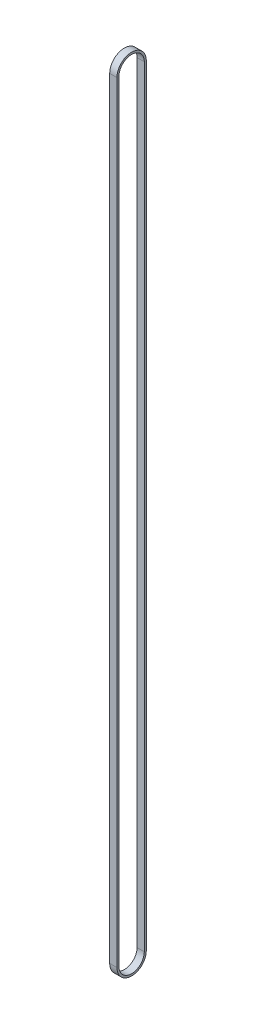
ISO-10303-21;
HEADER;
FILE_DESCRIPTION(('STEP AP214'),'2;1');
FILE_NAME('part.step','',(''),(''),'','','');
FILE_SCHEMA(('AUTOMOTIVE_DESIGN { 1 0 10303 214 1 1 1 1 }'));
ENDSEC;
DATA;
#1=APPLICATION_CONTEXT('core data for automotive mechanical design processes');
#2=APPLICATION_PROTOCOL_DEFINITION('international standard','automotive_design',2000,#1);
#3=PRODUCT_CONTEXT('',#1,'mechanical');
#4=PRODUCT('Part','Part','',(#3));
#5=PRODUCT_RELATED_PRODUCT_CATEGORY('part','',(#4));
#6=PRODUCT_DEFINITION_FORMATION('','',#4);
#7=PRODUCT_DEFINITION_CONTEXT('part definition',#1,'design');
#8=PRODUCT_DEFINITION('design','',#6,#7);
#9=PRODUCT_DEFINITION_SHAPE('','',#8);
#10=(LENGTH_UNIT() NAMED_UNIT(*) SI_UNIT(.MILLI.,.METRE.));
#11=(NAMED_UNIT(*) PLANE_ANGLE_UNIT() SI_UNIT($,.RADIAN.));
#12=(NAMED_UNIT(*) SI_UNIT($,.STERADIAN.) SOLID_ANGLE_UNIT());
#13=UNCERTAINTY_MEASURE_WITH_UNIT(LENGTH_MEASURE(1.E-05),#10,'distance_accuracy_value','');
#14=(GEOMETRIC_REPRESENTATION_CONTEXT(3) GLOBAL_UNCERTAINTY_ASSIGNED_CONTEXT((#13)) GLOBAL_UNIT_ASSIGNED_CONTEXT((#10,
#11,#12)) REPRESENTATION_CONTEXT('',''));
#15=CARTESIAN_POINT('',(0.,0.,0.));
#16=DIRECTION('',(0.,0.,1.));
#17=DIRECTION('',(1.,0.,0.));
#18=AXIS2_PLACEMENT_3D('',#15,#16,#17);
#19=CARTESIAN_POINT('',(186.865281719252,-665.401262874934,241.131305856301));
#20=DIRECTION('',(0.,0.,1.));
#21=DIRECTION('',(1.,0.,0.));
#22=AXIS2_PLACEMENT_3D('',#19,#20,#21);
#23=PLANE('',#22);
#24=CARTESIAN_POINT('',(191.865281719252,-133.401262874934,241.131305856301));
#25=CARTESIAN_POINT('',(191.865281719252,-665.401262874934,241.131305856301));
#26=(BOUNDED_CURVE() B_SPLINE_CURVE(1,(#24,#25),.UNSPECIFIED.,.F.,
.F.) B_SPLINE_CURVE_WITH_KNOTS((2,2),(0.,532.),
.UNSPECIFIED.) CURVE() GEOMETRIC_REPRESENTATION_ITEM() RATIONAL_B_SPLINE_CURVE((1.,1.)) REPRESENTATION_ITEM(''));
#27=CARTESIAN_POINT('',(191.865281719252,-133.401262874934,241.131305856301));
#28=VERTEX_POINT('',#27);
#29=CARTESIAN_POINT('',(191.865281719252,-665.401262874934,241.131305856301));
#30=VERTEX_POINT('',#29);
#31=EDGE_CURVE('E220',#28,#30,#26,.T.);
#32=ORIENTED_EDGE('',*,*,#31,.F.);
#33=CARTESIAN_POINT('',(186.865281719252,-133.401262874934,241.131305856301));
#34=CARTESIAN_POINT('',(191.865281719252,-133.401262874934,241.131305856301));
#35=(BOUNDED_CURVE() B_SPLINE_CURVE(1,(#33,#34),.UNSPECIFIED.,.F.,
.F.) B_SPLINE_CURVE_WITH_KNOTS((2,2),(0.,5.),
.UNSPECIFIED.) CURVE() GEOMETRIC_REPRESENTATION_ITEM() RATIONAL_B_SPLINE_CURVE((1.,1.)) REPRESENTATION_ITEM(''));
#36=CARTESIAN_POINT('',(186.865281719252,-133.401262874934,241.131305856301));
#37=VERTEX_POINT('',#36);
#38=EDGE_CURVE('E11',#37,#28,#35,.T.);
#39=ORIENTED_EDGE('',*,*,#38,.F.);
#40=CARTESIAN_POINT('',(186.865281719252,-133.401262874934,241.131305856301));
#41=CARTESIAN_POINT('',(186.865281719252,-665.401262874934,241.131305856301));
#42=(BOUNDED_CURVE() B_SPLINE_CURVE(1,(#40,#41),.UNSPECIFIED.,.F.,
.F.) B_SPLINE_CURVE_WITH_KNOTS((2,2),(0.,532.),
.UNSPECIFIED.) CURVE() GEOMETRIC_REPRESENTATION_ITEM() RATIONAL_B_SPLINE_CURVE((1.,1.)) REPRESENTATION_ITEM(''));
#43=CARTESIAN_POINT('',(186.865281719252,-665.401262874934,241.131305856301));
#44=VERTEX_POINT('',#43);
#45=EDGE_CURVE('E246',#37,#44,#42,.T.);
#46=ORIENTED_EDGE('',*,*,#45,.T.);
#47=CARTESIAN_POINT('',(186.865281719252,-665.401262874934,241.131305856301));
#48=CARTESIAN_POINT('',(191.865281719252,-665.401262874934,241.131305856301));
#49=(BOUNDED_CURVE() B_SPLINE_CURVE(1,(#47,#48),.UNSPECIFIED.,.F.,
.F.) B_SPLINE_CURVE_WITH_KNOTS((2,2),(0.,5.),
.UNSPECIFIED.) CURVE() GEOMETRIC_REPRESENTATION_ITEM() RATIONAL_B_SPLINE_CURVE((1.,1.)) REPRESENTATION_ITEM(''));
#50=EDGE_CURVE('E110',#44,#30,#49,.T.);
#51=ORIENTED_EDGE('',*,*,#50,.T.);
#52=EDGE_LOOP('',(#32,#39,#46,#51));
#53=FACE_BOUND('',#52,.T.);
#54=ADVANCED_FACE('F51',(#53),#23,.T.);
#55=CARTESIAN_POINT('',(186.865281719252,-133.401262874934,241.131305856301));
#56=CARTESIAN_POINT('',(186.865281719252,-124.651262874934,241.131305856301));
#57=CARTESIAN_POINT('',(186.865281719252,-124.651262874934,249.881305856301));
#58=CARTESIAN_POINT('',(186.865281719252,-124.651262874934,258.631305856301));
#59=CARTESIAN_POINT('',(186.865281719252,-133.401262874934,258.631305856301));
#60=CARTESIAN_POINT('',(191.865281719252,-133.401262874934,241.131305856301));
#61=CARTESIAN_POINT('',(191.865281719252,-124.651262874934,241.131305856301));
#62=CARTESIAN_POINT('',(191.865281719252,-124.651262874934,249.881305856301));
#63=CARTESIAN_POINT('',(191.865281719252,-124.651262874934,258.631305856301));
#64=CARTESIAN_POINT('',(191.865281719252,-133.401262874934,258.631305856301));
#65=(BOUNDED_SURFACE() B_SPLINE_SURFACE(1,2,((#55,#56,#57,#58,#59),(#60,#61,#62,#63,#64)),
.UNSPECIFIED.,.F.,.F.,.F.) B_SPLINE_SURFACE_WITH_KNOTS((2,2),(3,2,3),(0.,5.),(1.5707963267949,
3.14159265358979,4.71238898038469),
.UNSPECIFIED.) GEOMETRIC_REPRESENTATION_ITEM() RATIONAL_B_SPLINE_SURFACE(((1.,0.707106781186547,
1.,0.707106781186547,1.),(1.,0.707106781186547,1.,0.707106781186547,1.))) REPRESENTATION_ITEM('') SURFACE());
#66=CARTESIAN_POINT('',(191.865281719252,-133.401262874934,258.631305856301));
#67=CARTESIAN_POINT('',(191.865281719252,-124.651262874934,258.631305856301));
#68=CARTESIAN_POINT('',(191.865281719252,-124.651262874934,249.881305856301));
#69=CARTESIAN_POINT('',(191.865281719252,-124.651262874934,241.131305856301));
#70=CARTESIAN_POINT('',(191.865281719252,-133.401262874934,241.131305856301));
#71=(BOUNDED_CURVE() B_SPLINE_CURVE(2,(#66,#67,#68,#69,#70),.UNSPECIFIED.,.F.,
.F.) B_SPLINE_CURVE_WITH_KNOTS((3,2,3),(0.,13.7444678594553,27.4889357189107),
.UNSPECIFIED.) CURVE() GEOMETRIC_REPRESENTATION_ITEM() RATIONAL_B_SPLINE_CURVE((1.,
0.707106781186548,1.,0.707106781186548,1.)) REPRESENTATION_ITEM(''));
#72=CARTESIAN_POINT('',(191.865281719252,-133.401262874934,258.631305856301));
#73=VERTEX_POINT('',#72);
#74=EDGE_CURVE('E211',#73,#28,#71,.T.);
#75=CARTESIAN_POINT('',(186.865281719252,-133.401262874934,258.631305856301));
#76=CARTESIAN_POINT('',(191.865281719252,-133.401262874934,258.631305856301));
#77=(BOUNDED_CURVE() B_SPLINE_CURVE(1,(#75,#76),.UNSPECIFIED.,.F.,
.F.) B_SPLINE_CURVE_WITH_KNOTS((2,2),(0.,5.),
.UNSPECIFIED.) CURVE() GEOMETRIC_REPRESENTATION_ITEM() RATIONAL_B_SPLINE_CURVE((1.,1.)) REPRESENTATION_ITEM(''));
#78=CARTESIAN_POINT('',(186.865281719252,-133.401262874934,258.631305856301));
#79=VERTEX_POINT('',#78);
#80=EDGE_CURVE('E61',#79,#73,#77,.T.);
#81=CARTESIAN_POINT('',(186.865281719252,-133.401262874934,258.631305856301));
#82=CARTESIAN_POINT('',(186.865281719252,-124.651262874934,258.631305856301));
#83=CARTESIAN_POINT('',(186.865281719252,-124.651262874934,249.881305856301));
#84=CARTESIAN_POINT('',(186.865281719252,-124.651262874934,241.131305856301));
#85=CARTESIAN_POINT('',(186.865281719252,-133.401262874934,241.131305856301));
#86=(BOUNDED_CURVE() B_SPLINE_CURVE(2,(#81,#82,#83,#84,#85),.UNSPECIFIED.,.F.,
.F.) B_SPLINE_CURVE_WITH_KNOTS((3,2,3),(0.,13.7444678594553,27.4889357189107),
.UNSPECIFIED.) CURVE() GEOMETRIC_REPRESENTATION_ITEM() RATIONAL_B_SPLINE_CURVE((1.,
0.707106781186548,1.,0.707106781186548,1.)) REPRESENTATION_ITEM(''));
#87=EDGE_CURVE('E254',#79,#37,#86,.T.);
#88=ORIENTED_EDGE('',*,*,#74,.F.);
#89=ORIENTED_EDGE('',*,*,#80,.F.);
#90=ORIENTED_EDGE('',*,*,#87,.T.);
#91=ORIENTED_EDGE('',*,*,#38,.T.);
#92=EDGE_LOOP('',(#88,#89,#90,#91));
#93=FACE_BOUND('',#92,.T.);
#94=ADVANCED_FACE('F354',(#93),#65,.T.);
#95=CARTESIAN_POINT('',(191.865281719252,-665.401262874934,258.631305856301));
#96=DIRECTION('',(0.,0.,-1.));
#97=DIRECTION('',(0.,-1.,0.));
#98=AXIS2_PLACEMENT_3D('',#95,#96,#97);
#99=PLANE('',#98);
#100=CARTESIAN_POINT('',(191.865281719252,-665.401262874934,258.631305856301));
#101=CARTESIAN_POINT('',(191.865281719252,-133.401262874934,258.631305856301));
#102=(BOUNDED_CURVE() B_SPLINE_CURVE(1,(#100,#101),.UNSPECIFIED.,.F.,
.F.) B_SPLINE_CURVE_WITH_KNOTS((2,2),(0.,532.),
.UNSPECIFIED.) CURVE() GEOMETRIC_REPRESENTATION_ITEM() RATIONAL_B_SPLINE_CURVE((1.,1.)) REPRESENTATION_ITEM(''));
#103=CARTESIAN_POINT('',(191.865281719252,-665.401262874934,258.631305856301));
#104=VERTEX_POINT('',#103);
#105=EDGE_CURVE('E221',#104,#73,#102,.T.);
#106=ORIENTED_EDGE('',*,*,#105,.F.);
#107=CARTESIAN_POINT('',(186.865281719252,-665.401262874934,258.631305856301));
#108=CARTESIAN_POINT('',(191.865281719252,-665.401262874934,258.631305856301));
#109=(BOUNDED_CURVE() B_SPLINE_CURVE(1,(#107,#108),.UNSPECIFIED.,.F.,
.F.) B_SPLINE_CURVE_WITH_KNOTS((2,2),(0.,5.),
.UNSPECIFIED.) CURVE() GEOMETRIC_REPRESENTATION_ITEM() RATIONAL_B_SPLINE_CURVE((1.,1.)) REPRESENTATION_ITEM(''));
#110=CARTESIAN_POINT('',(186.865281719252,-665.401262874934,258.631305856301));
#111=VERTEX_POINT('',#110);
#112=EDGE_CURVE('E134',#111,#104,#109,.T.);
#113=ORIENTED_EDGE('',*,*,#112,.F.);
#114=CARTESIAN_POINT('',(186.865281719252,-665.401262874934,258.631305856301));
#115=CARTESIAN_POINT('',(186.865281719252,-133.401262874934,258.631305856301));
#116=(BOUNDED_CURVE() B_SPLINE_CURVE(1,(#114,#115),.UNSPECIFIED.,.F.,
.F.) B_SPLINE_CURVE_WITH_KNOTS((2,2),(0.,532.),
.UNSPECIFIED.) CURVE() GEOMETRIC_REPRESENTATION_ITEM() RATIONAL_B_SPLINE_CURVE((1.,1.)) REPRESENTATION_ITEM(''));
#117=EDGE_CURVE('E176',#111,#79,#116,.T.);
#118=ORIENTED_EDGE('',*,*,#117,.T.);
#119=ORIENTED_EDGE('',*,*,#80,.T.);
#120=EDGE_LOOP('',(#106,#113,#118,#119));
#121=FACE_BOUND('',#120,.T.);
#122=ADVANCED_FACE('F349',(#121),#99,.T.);
#123=CARTESIAN_POINT('',(186.865281719252,-665.401262874934,258.631305856301));
#124=CARTESIAN_POINT('',(186.865281719252,-674.151262874934,258.631305856301));
#125=CARTESIAN_POINT('',(186.865281719252,-674.151262874934,249.881305856301));
#126=CARTESIAN_POINT('',(186.865281719252,-674.151262874934,241.131305856301));
#127=CARTESIAN_POINT('',(186.865281719252,-665.401262874934,241.131305856301));
#128=CARTESIAN_POINT('',(191.865281719252,-665.401262874934,258.631305856301));
#129=CARTESIAN_POINT('',(191.865281719252,-674.151262874934,258.631305856301));
#130=CARTESIAN_POINT('',(191.865281719252,-674.151262874934,249.881305856301));
#131=CARTESIAN_POINT('',(191.865281719252,-674.151262874934,241.131305856301));
#132=CARTESIAN_POINT('',(191.865281719252,-665.401262874934,241.131305856301));
#133=(BOUNDED_SURFACE() B_SPLINE_SURFACE(1,2,((#123,#124,#125,#126,#127),(#128,#129,#130,#131,
#132)),.UNSPECIFIED.,.F.,.F.,.F.) B_SPLINE_SURFACE_WITH_KNOTS((2,2),(3,2,3),(0.,5.),
(1.5707963267949,3.14159265358979,4.71238898038469),
.UNSPECIFIED.) GEOMETRIC_REPRESENTATION_ITEM() RATIONAL_B_SPLINE_SURFACE(((1.,0.707106781186548,
1.,0.707106781186548,1.),(1.,0.707106781186548,1.,0.707106781186548,1.))) REPRESENTATION_ITEM('') SURFACE());
#134=CARTESIAN_POINT('',(191.865281719252,-665.401262874934,241.131305856301));
#135=CARTESIAN_POINT('',(191.865281719252,-674.151262874934,241.131305856301));
#136=CARTESIAN_POINT('',(191.865281719252,-674.151262874934,249.881305856301));
#137=CARTESIAN_POINT('',(191.865281719252,-674.151262874934,258.631305856301));
#138=CARTESIAN_POINT('',(191.865281719252,-665.401262874934,258.631305856301));
#139=(BOUNDED_CURVE() B_SPLINE_CURVE(2,(#134,#135,#136,#137,#138),.UNSPECIFIED.,.F.,
.F.) B_SPLINE_CURVE_WITH_KNOTS((3,2,3),(0.,13.7444678594553,27.4889357189107),
.UNSPECIFIED.) CURVE() GEOMETRIC_REPRESENTATION_ITEM() RATIONAL_B_SPLINE_CURVE((1.,
0.707106781186548,1.,0.707106781186548,1.)) REPRESENTATION_ITEM(''));
#140=EDGE_CURVE('E270',#30,#104,#139,.T.);
#141=CARTESIAN_POINT('',(186.865281719252,-665.401262874934,241.131305856301));
#142=CARTESIAN_POINT('',(186.865281719252,-674.151262874934,241.131305856301));
#143=CARTESIAN_POINT('',(186.865281719252,-674.151262874934,249.881305856301));
#144=CARTESIAN_POINT('',(186.865281719252,-674.151262874934,258.631305856301));
#145=CARTESIAN_POINT('',(186.865281719252,-665.401262874934,258.631305856301));
#146=(BOUNDED_CURVE() B_SPLINE_CURVE(2,(#141,#142,#143,#144,#145),.UNSPECIFIED.,.F.,
.F.) B_SPLINE_CURVE_WITH_KNOTS((3,2,3),(0.,13.7444678594553,27.4889357189107),
.UNSPECIFIED.) CURVE() GEOMETRIC_REPRESENTATION_ITEM() RATIONAL_B_SPLINE_CURVE((1.,
0.707106781186548,1.,0.707106781186548,1.)) REPRESENTATION_ITEM(''));
#147=EDGE_CURVE('E238',#44,#111,#146,.T.);
#148=ORIENTED_EDGE('',*,*,#140,.F.);
#149=ORIENTED_EDGE('',*,*,#50,.F.);
#150=ORIENTED_EDGE('',*,*,#147,.T.);
#151=ORIENTED_EDGE('',*,*,#112,.T.);
#152=EDGE_LOOP('',(#148,#149,#150,#151));
#153=FACE_BOUND('',#152,.T.);
#154=ADVANCED_FACE('F346',(#153),#133,.T.);
#155=CARTESIAN_POINT('',(186.865281719252,-665.401262874934,239.751305856301));
#156=DIRECTION('',(0.,0.,-1.));
#157=DIRECTION('',(0.,-1.,0.));
#158=AXIS2_PLACEMENT_3D('',#155,#156,#157);
#159=PLANE('',#158);
#160=CARTESIAN_POINT('',(191.865281719252,-133.401262874934,239.751305856301));
#161=CARTESIAN_POINT('',(191.865281719252,-665.401262874934,239.751305856301));
#162=(BOUNDED_CURVE() B_SPLINE_CURVE(1,(#160,#161),.UNSPECIFIED.,.F.,
.F.) B_SPLINE_CURVE_WITH_KNOTS((2,2),(0.,532.),
.UNSPECIFIED.) CURVE() GEOMETRIC_REPRESENTATION_ITEM() RATIONAL_B_SPLINE_CURVE((1.,1.)) REPRESENTATION_ITEM(''));
#163=CARTESIAN_POINT('',(191.865281719252,-133.401262874934,239.751305856301));
#164=VERTEX_POINT('',#163);
#165=CARTESIAN_POINT('',(191.865281719252,-665.401262874934,239.751305856301));
#166=VERTEX_POINT('',#165);
#167=EDGE_CURVE('E161',#164,#166,#162,.T.);
#168=ORIENTED_EDGE('',*,*,#167,.T.);
#169=CARTESIAN_POINT('',(186.865281719252,-665.401262874934,239.751305856301));
#170=CARTESIAN_POINT('',(191.865281719252,-665.401262874934,239.751305856301));
#171=(BOUNDED_CURVE() B_SPLINE_CURVE(1,(#169,#170),.UNSPECIFIED.,.F.,
.F.) B_SPLINE_CURVE_WITH_KNOTS((2,2),(0.,5.),
.UNSPECIFIED.) CURVE() GEOMETRIC_REPRESENTATION_ITEM() RATIONAL_B_SPLINE_CURVE((1.,1.)) REPRESENTATION_ITEM(''));
#172=CARTESIAN_POINT('',(186.865281719252,-665.401262874934,239.751305856301));
#173=VERTEX_POINT('',#172);
#174=EDGE_CURVE('E155',#173,#166,#171,.T.);
#175=ORIENTED_EDGE('',*,*,#174,.F.);
#176=CARTESIAN_POINT('',(186.865281719252,-133.401262874934,239.751305856301));
#177=CARTESIAN_POINT('',(186.865281719252,-665.401262874934,239.751305856301));
#178=(BOUNDED_CURVE() B_SPLINE_CURVE(1,(#176,#177),.UNSPECIFIED.,.F.,
.F.) B_SPLINE_CURVE_WITH_KNOTS((2,2),(0.,532.),
.UNSPECIFIED.) CURVE() GEOMETRIC_REPRESENTATION_ITEM() RATIONAL_B_SPLINE_CURVE((1.,1.)) REPRESENTATION_ITEM(''));
#179=CARTESIAN_POINT('',(186.865281719252,-133.401262874934,239.751305856301));
#180=VERTEX_POINT('',#179);
#181=EDGE_CURVE('E158',#180,#173,#178,.T.);
#182=ORIENTED_EDGE('',*,*,#181,.F.);
#183=CARTESIAN_POINT('',(186.865281719252,-133.401262874934,239.751305856301));
#184=CARTESIAN_POINT('',(191.865281719252,-133.401262874934,239.751305856301));
#185=(BOUNDED_CURVE() B_SPLINE_CURVE(1,(#183,#184),.UNSPECIFIED.,.F.,
.F.) B_SPLINE_CURVE_WITH_KNOTS((2,2),(0.,5.),
.UNSPECIFIED.) CURVE() GEOMETRIC_REPRESENTATION_ITEM() RATIONAL_B_SPLINE_CURVE((1.,1.)) REPRESENTATION_ITEM(''));
#186=EDGE_CURVE('E140',#180,#164,#185,.T.);
#187=ORIENTED_EDGE('',*,*,#186,.T.);
#188=EDGE_LOOP('',(#168,#175,#182,#187));
#189=FACE_BOUND('',#188,.T.);
#190=ADVANCED_FACE('F157',(#189),#159,.T.);
#191=CARTESIAN_POINT('',(186.865281719252,-133.401262874934,239.751305856301));
#192=CARTESIAN_POINT('',(191.865281719252,-133.401262874934,239.751305856301));
#193=CARTESIAN_POINT('',(186.865281719252,-123.271262874934,239.751305856301));
#194=CARTESIAN_POINT('',(191.865281719252,-123.271262874934,239.751305856301));
#195=CARTESIAN_POINT('',(186.865281719252,-123.271262874934,249.881305856301));
#196=CARTESIAN_POINT('',(191.865281719252,-123.271262874934,249.881305856301));
#197=CARTESIAN_POINT('',(186.865281719252,-123.271262874934,260.011305856301));
#198=CARTESIAN_POINT('',(191.865281719252,-123.271262874934,260.011305856301));
#199=CARTESIAN_POINT('',(186.865281719252,-133.401262874934,260.011305856301));
#200=CARTESIAN_POINT('',(191.865281719252,-133.401262874934,260.011305856301));
#201=(BOUNDED_SURFACE() B_SPLINE_SURFACE(2,1,((#191,#192),(#193,#194),(#195,#196),(#197,#198),
(#199,#200)),.UNSPECIFIED.,.F.,.F.,.F.) B_SPLINE_SURFACE_WITH_KNOTS((3,2,3),(2,2),
(1.5707963267949,3.14159265358979,4.71238898038469),(0.,5.),
.UNSPECIFIED.) GEOMETRIC_REPRESENTATION_ITEM() RATIONAL_B_SPLINE_SURFACE(((1.,1.),
(0.707106781186548,0.707106781186548),(1.,1.),(0.707106781186548,0.707106781186548),(1.,1.))) REPRESENTATION_ITEM('') SURFACE());
#202=CARTESIAN_POINT('',(191.865281719252,-133.401262874934,260.011305856301));
#203=CARTESIAN_POINT('',(191.865281719252,-123.271262874934,260.011305856301));
#204=CARTESIAN_POINT('',(191.865281719252,-123.271262874934,249.881305856301));
#205=CARTESIAN_POINT('',(191.865281719252,-123.271262874934,239.751305856301));
#206=CARTESIAN_POINT('',(191.865281719252,-133.401262874934,239.751305856301));
#207=(BOUNDED_CURVE() B_SPLINE_CURVE(2,(#202,#203,#204,#205,#206),.UNSPECIFIED.,.F.,
.F.) B_SPLINE_CURVE_WITH_KNOTS((3,2,3),(0.,15.9121667904323,31.8243335808646),
.UNSPECIFIED.) CURVE() GEOMETRIC_REPRESENTATION_ITEM() RATIONAL_B_SPLINE_CURVE((1.,
0.707106781186548,1.,0.707106781186548,1.)) REPRESENTATION_ITEM(''));
#208=CARTESIAN_POINT('',(191.865281719252,-133.401262874934,260.011305856301));
#209=VERTEX_POINT('',#208);
#210=EDGE_CURVE('E222',#209,#164,#207,.T.);
#211=CARTESIAN_POINT('',(186.865281719252,-133.401262874934,260.011305856301));
#212=CARTESIAN_POINT('',(186.865281719252,-123.271262874934,260.011305856301));
#213=CARTESIAN_POINT('',(186.865281719252,-123.271262874934,249.881305856301));
#214=CARTESIAN_POINT('',(186.865281719252,-123.271262874934,239.751305856301));
#215=CARTESIAN_POINT('',(186.865281719252,-133.401262874934,239.751305856301));
#216=(BOUNDED_CURVE() B_SPLINE_CURVE(2,(#211,#212,#213,#214,#215),.UNSPECIFIED.,.F.,
.F.) B_SPLINE_CURVE_WITH_KNOTS((3,2,3),(0.,15.9121667904323,31.8243335808646),
.UNSPECIFIED.) CURVE() GEOMETRIC_REPRESENTATION_ITEM() RATIONAL_B_SPLINE_CURVE((1.,
0.707106781186548,1.,0.707106781186548,1.)) REPRESENTATION_ITEM(''));
#217=CARTESIAN_POINT('',(186.865281719252,-133.401262874934,260.011305856301));
#218=VERTEX_POINT('',#217);
#219=EDGE_CURVE('E174',#218,#180,#216,.T.);
#220=CARTESIAN_POINT('',(186.865281719252,-133.401262874934,260.011305856301));
#221=CARTESIAN_POINT('',(191.865281719252,-133.401262874934,260.011305856301));
#222=(BOUNDED_CURVE() B_SPLINE_CURVE(1,(#220,#221),.UNSPECIFIED.,.F.,
.F.) B_SPLINE_CURVE_WITH_KNOTS((2,2),(0.,5.),
.UNSPECIFIED.) CURVE() GEOMETRIC_REPRESENTATION_ITEM() RATIONAL_B_SPLINE_CURVE((1.,1.)) REPRESENTATION_ITEM(''));
#223=EDGE_CURVE('E122',#218,#209,#222,.T.);
#224=ORIENTED_EDGE('',*,*,#210,.T.);
#225=ORIENTED_EDGE('',*,*,#186,.F.);
#226=ORIENTED_EDGE('',*,*,#219,.F.);
#227=ORIENTED_EDGE('',*,*,#223,.T.);
#228=EDGE_LOOP('',(#224,#225,#226,#227));
#229=FACE_BOUND('',#228,.T.);
#230=ADVANCED_FACE('F380',(#229),#201,.T.);
#231=CARTESIAN_POINT('',(191.865281719252,-665.401262874934,260.011305856301));
#232=DIRECTION('',(0.,0.,1.));
#233=DIRECTION('',(1.,0.,0.));
#234=AXIS2_PLACEMENT_3D('',#231,#232,#233);
#235=PLANE('',#234);
#236=CARTESIAN_POINT('',(191.865281719252,-665.401262874934,260.011305856301));
#237=CARTESIAN_POINT('',(191.865281719252,-133.401262874934,260.011305856301));
#238=(BOUNDED_CURVE() B_SPLINE_CURVE(1,(#236,#237),.UNSPECIFIED.,.F.,
.F.) B_SPLINE_CURVE_WITH_KNOTS((2,2),(0.,532.),
.UNSPECIFIED.) CURVE() GEOMETRIC_REPRESENTATION_ITEM() RATIONAL_B_SPLINE_CURVE((1.,1.)) REPRESENTATION_ITEM(''));
#239=CARTESIAN_POINT('',(191.865281719252,-665.401262874934,260.011305856301));
#240=VERTEX_POINT('',#239);
#241=EDGE_CURVE('E230',#240,#209,#238,.T.);
#242=ORIENTED_EDGE('',*,*,#241,.T.);
#243=ORIENTED_EDGE('',*,*,#223,.F.);
#244=CARTESIAN_POINT('',(186.865281719252,-665.401262874934,260.011305856301));
#245=CARTESIAN_POINT('',(186.865281719252,-133.401262874934,260.011305856301));
#246=(BOUNDED_CURVE() B_SPLINE_CURVE(1,(#244,#245),.UNSPECIFIED.,.F.,
.F.) B_SPLINE_CURVE_WITH_KNOTS((2,2),(0.,532.),
.UNSPECIFIED.) CURVE() GEOMETRIC_REPRESENTATION_ITEM() RATIONAL_B_SPLINE_CURVE((1.,1.)) REPRESENTATION_ITEM(''));
#247=CARTESIAN_POINT('',(186.865281719252,-665.401262874934,260.011305856301));
#248=VERTEX_POINT('',#247);
#249=EDGE_CURVE('E181',#248,#218,#246,.T.);
#250=ORIENTED_EDGE('',*,*,#249,.F.);
#251=CARTESIAN_POINT('',(186.865281719252,-665.401262874934,260.011305856301));
#252=CARTESIAN_POINT('',(191.865281719252,-665.401262874934,260.011305856301));
#253=(BOUNDED_CURVE() B_SPLINE_CURVE(1,(#251,#252),.UNSPECIFIED.,.F.,
.F.) B_SPLINE_CURVE_WITH_KNOTS((2,2),(0.,5.),
.UNSPECIFIED.) CURVE() GEOMETRIC_REPRESENTATION_ITEM() RATIONAL_B_SPLINE_CURVE((1.,1.)) REPRESENTATION_ITEM(''));
#254=EDGE_CURVE('E167',#248,#240,#253,.T.);
#255=ORIENTED_EDGE('',*,*,#254,.T.);
#256=EDGE_LOOP('',(#242,#243,#250,#255));
#257=FACE_BOUND('',#256,.T.);
#258=ADVANCED_FACE('F390',(#257),#235,.T.);
#259=CARTESIAN_POINT('',(186.865281719252,-665.401262874934,260.011305856301));
#260=CARTESIAN_POINT('',(191.865281719252,-665.401262874934,260.011305856301));
#261=CARTESIAN_POINT('',(186.865281719252,-675.531262874933,260.011305856301));
#262=CARTESIAN_POINT('',(191.865281719252,-675.531262874933,260.011305856301));
#263=CARTESIAN_POINT('',(186.865281719252,-675.531262874934,249.881305856301));
#264=CARTESIAN_POINT('',(191.865281719252,-675.531262874934,249.881305856301));
#265=CARTESIAN_POINT('',(186.865281719252,-675.531262874933,239.751305856301));
#266=CARTESIAN_POINT('',(191.865281719252,-675.531262874933,239.751305856301));
#267=CARTESIAN_POINT('',(186.865281719252,-665.401262874934,239.751305856301));
#268=CARTESIAN_POINT('',(191.865281719252,-665.401262874934,239.751305856301));
#269=(BOUNDED_SURFACE() B_SPLINE_SURFACE(2,1,((#259,#260),(#261,#262),(#263,#264),(#265,#266),
(#267,#268)),.UNSPECIFIED.,.F.,.F.,.F.) B_SPLINE_SURFACE_WITH_KNOTS((3,2,3),(2,2),
(1.5707963267949,3.14159265358979,4.71238898038469),(0.,5.),
.UNSPECIFIED.) GEOMETRIC_REPRESENTATION_ITEM() RATIONAL_B_SPLINE_SURFACE(((1.,1.),
(0.707106781186548,0.707106781186548),(1.,1.),(0.707106781186548,0.707106781186548),(1.,1.))) REPRESENTATION_ITEM('') SURFACE());
#270=CARTESIAN_POINT('',(191.865281719252,-665.401262874934,239.751305856301));
#271=CARTESIAN_POINT('',(191.865281719252,-675.531262874933,239.751305856301));
#272=CARTESIAN_POINT('',(191.865281719252,-675.531262874934,249.881305856301));
#273=CARTESIAN_POINT('',(191.865281719252,-675.531262874933,260.011305856301));
#274=CARTESIAN_POINT('',(191.865281719252,-665.401262874934,260.011305856301));
#275=(BOUNDED_CURVE() B_SPLINE_CURVE(2,(#270,#271,#272,#273,#274),.UNSPECIFIED.,.F.,
.F.) B_SPLINE_CURVE_WITH_KNOTS((3,2,3),(0.,15.9121667904323,31.8243335808646),
.UNSPECIFIED.) CURVE() GEOMETRIC_REPRESENTATION_ITEM() RATIONAL_B_SPLINE_CURVE((1.,
0.707106781186548,1.,0.707106781186548,1.)) REPRESENTATION_ITEM(''));
#276=EDGE_CURVE('E262',#166,#240,#275,.T.);
#277=CARTESIAN_POINT('',(186.865281719252,-665.401262874934,239.751305856301));
#278=CARTESIAN_POINT('',(186.865281719252,-675.531262874933,239.751305856301));
#279=CARTESIAN_POINT('',(186.865281719252,-675.531262874934,249.881305856301));
#280=CARTESIAN_POINT('',(186.865281719252,-675.531262874933,260.011305856301));
#281=CARTESIAN_POINT('',(186.865281719252,-665.401262874934,260.011305856301));
#282=(BOUNDED_CURVE() B_SPLINE_CURVE(2,(#277,#278,#279,#280,#281),.UNSPECIFIED.,.F.,
.F.) B_SPLINE_CURVE_WITH_KNOTS((3,2,3),(0.,15.9121667904323,31.8243335808646),
.UNSPECIFIED.) CURVE() GEOMETRIC_REPRESENTATION_ITEM() RATIONAL_B_SPLINE_CURVE((1.,
0.707106781186548,1.,0.707106781186548,1.)) REPRESENTATION_ITEM(''));
#283=EDGE_CURVE('E173',#173,#248,#282,.T.);
#284=ORIENTED_EDGE('',*,*,#276,.T.);
#285=ORIENTED_EDGE('',*,*,#254,.F.);
#286=ORIENTED_EDGE('',*,*,#283,.F.);
#287=ORIENTED_EDGE('',*,*,#174,.T.);
#288=EDGE_LOOP('',(#284,#285,#286,#287));
#289=FACE_BOUND('',#288,.T.);
#290=ADVANCED_FACE('F178',(#289),#269,.T.);
#291=CARTESIAN_POINT('',(191.865281719252,-675.531262874934,260.011305856301));
#292=DIRECTION('',(1.,0.,0.));
#293=DIRECTION('',(0.,1.,0.));
#294=AXIS2_PLACEMENT_3D('',#291,#292,#293);
#295=PLANE('',#294);
#296=ORIENTED_EDGE('',*,*,#140,.T.);
#297=ORIENTED_EDGE('',*,*,#105,.T.);
#298=ORIENTED_EDGE('',*,*,#74,.T.);
#299=ORIENTED_EDGE('',*,*,#31,.T.);
#300=EDGE_LOOP('',(#296,#297,#298,#299));
#301=FACE_BOUND('',#300,.T.);
#302=ORIENTED_EDGE('',*,*,#276,.F.);
#303=ORIENTED_EDGE('',*,*,#167,.F.);
#304=ORIENTED_EDGE('',*,*,#210,.F.);
#305=ORIENTED_EDGE('',*,*,#241,.F.);
#306=EDGE_LOOP('',(#302,#303,#304,#305));
#307=FACE_BOUND('',#306,.T.);
#308=ADVANCED_FACE('F351',(#301,#307),#295,.T.);
#309=CARTESIAN_POINT('',(186.865281719252,-675.531262874934,260.011305856301));
#310=DIRECTION('',(-1.,0.,0.));
#311=DIRECTION('',(0.,0.,1.));
#312=AXIS2_PLACEMENT_3D('',#309,#310,#311);
#313=PLANE('',#312);
#314=ORIENTED_EDGE('',*,*,#117,.F.);
#315=ORIENTED_EDGE('',*,*,#147,.F.);
#316=ORIENTED_EDGE('',*,*,#45,.F.);
#317=ORIENTED_EDGE('',*,*,#87,.F.);
#318=EDGE_LOOP('',(#314,#315,#316,#317));
#319=FACE_BOUND('',#318,.T.);
#320=ORIENTED_EDGE('',*,*,#283,.T.);
#321=ORIENTED_EDGE('',*,*,#249,.T.);
#322=ORIENTED_EDGE('',*,*,#219,.T.);
#323=ORIENTED_EDGE('',*,*,#181,.T.);
#324=EDGE_LOOP('',(#320,#321,#322,#323));
#325=FACE_BOUND('',#324,.T.);
#326=ADVANCED_FACE('F171',(#319,#325),#313,.T.);
#327=CLOSED_SHELL('',(#54,#94,#122,#154,#190,#230,#258,#290,#308,#326));
#328=MANIFOLD_SOLID_BREP('B2',#327);
#329=ADVANCED_BREP_SHAPE_REPRESENTATION('',(#18,#328),#14);
#330=SHAPE_DEFINITION_REPRESENTATION(#9,#329);
ENDSEC;
END-ISO-10303-21;
